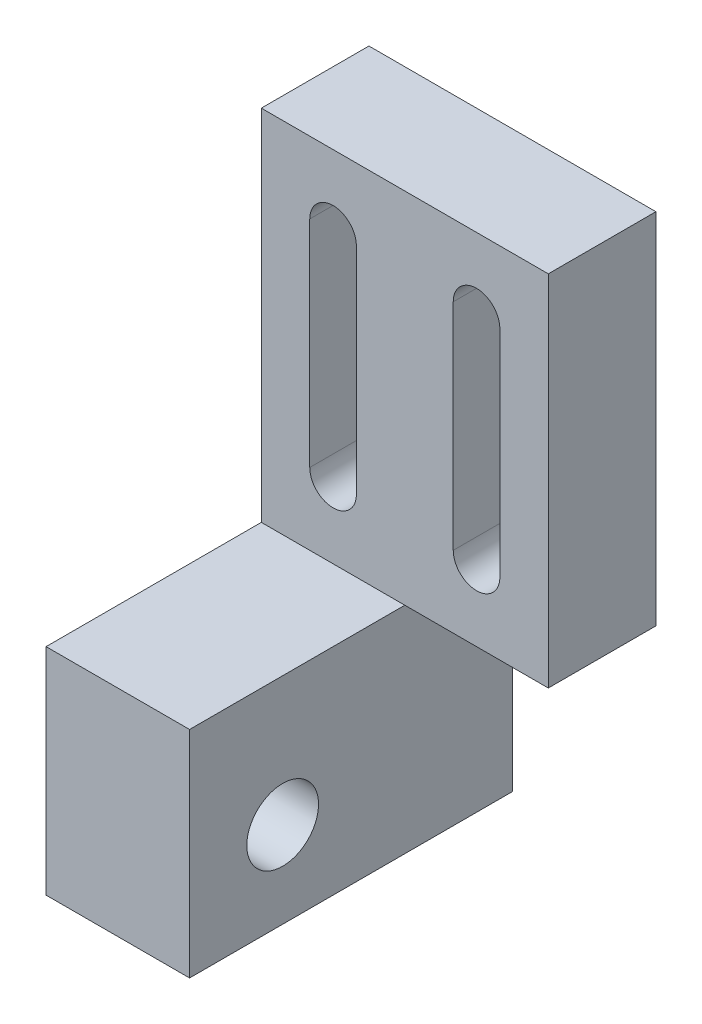
ISO-10303-21;
HEADER;
FILE_DESCRIPTION(('STEP AP214'),'2;1');
FILE_NAME('part.step','',(''),(''),'','','');
FILE_SCHEMA(('AUTOMOTIVE_DESIGN { 1 0 10303 214 1 1 1 1 }'));
ENDSEC;
DATA;
#1=APPLICATION_CONTEXT('core data for automotive mechanical design processes');
#2=APPLICATION_PROTOCOL_DEFINITION('international standard','automotive_design',2000,#1);
#3=PRODUCT_CONTEXT('',#1,'mechanical');
#4=PRODUCT('Part','Part','',(#3));
#5=PRODUCT_RELATED_PRODUCT_CATEGORY('part','',(#4));
#6=PRODUCT_DEFINITION_FORMATION('','',#4);
#7=PRODUCT_DEFINITION_CONTEXT('part definition',#1,'design');
#8=PRODUCT_DEFINITION('design','',#6,#7);
#9=PRODUCT_DEFINITION_SHAPE('','',#8);
#10=(LENGTH_UNIT() NAMED_UNIT(*) SI_UNIT(.MILLI.,.METRE.));
#11=(NAMED_UNIT(*) PLANE_ANGLE_UNIT() SI_UNIT($,.RADIAN.));
#12=(NAMED_UNIT(*) SI_UNIT($,.STERADIAN.) SOLID_ANGLE_UNIT());
#13=UNCERTAINTY_MEASURE_WITH_UNIT(LENGTH_MEASURE(1.E-05),#10,'distance_accuracy_value','');
#14=(GEOMETRIC_REPRESENTATION_CONTEXT(3) GLOBAL_UNCERTAINTY_ASSIGNED_CONTEXT((#13)) GLOBAL_UNIT_ASSIGNED_CONTEXT((#10,
#11,#12)) REPRESENTATION_CONTEXT('',''));
#15=CARTESIAN_POINT('',(0.,0.,0.));
#16=DIRECTION('',(0.,0.,1.));
#17=DIRECTION('',(1.,0.,0.));
#18=AXIS2_PLACEMENT_3D('',#15,#16,#17);
#19=CARTESIAN_POINT('',(-84.6,6.47000000000013,9.));
#20=DIRECTION('',(0.,-1.,0.));
#21=DIRECTION('',(0.,0.,-1.));
#22=AXIS2_PLACEMENT_3D('',#19,#20,#21);
#23=PLANE('',#22);
#24=DIRECTION('',(1.,0.,0.));
#25=VECTOR('',#24,1.);
#26=CARTESIAN_POINT('',(-84.6,6.47000000000013,3.));
#27=LINE('',#26,#25);
#28=CARTESIAN_POINT('',(-84.6,6.47000000000013,3.));
#29=VERTEX_POINT('',#28);
#30=CARTESIAN_POINT('',(-80.6,6.47000000000013,3.));
#31=VERTEX_POINT('',#30);
#32=EDGE_CURVE('E224',#29,#31,#27,.T.);
#33=ORIENTED_EDGE('',*,*,#32,.F.);
#34=DIRECTION('',(0.,0.,-1.));
#35=VECTOR('',#34,1.);
#36=CARTESIAN_POINT('',(-84.6,6.47000000000013,9.));
#37=LINE('',#36,#35);
#38=CARTESIAN_POINT('',(-84.6,6.47000000000013,9.));
#39=VERTEX_POINT('',#38);
#40=EDGE_CURVE('E257',#39,#29,#37,.T.);
#41=ORIENTED_EDGE('',*,*,#40,.F.);
#42=DIRECTION('',(-1.,0.,0.));
#43=VECTOR('',#42,1.);
#44=CARTESIAN_POINT('',(-84.6,6.47000000000013,9.));
#45=LINE('',#44,#43);
#46=CARTESIAN_POINT('',(-80.6,6.47000000000013,9.));
#47=VERTEX_POINT('',#46);
#48=EDGE_CURVE('E255',#47,#39,#45,.T.);
#49=ORIENTED_EDGE('',*,*,#48,.F.);
#50=DIRECTION('',(0.,0.,-1.));
#51=VECTOR('',#50,1.);
#52=CARTESIAN_POINT('',(-80.6,6.47000000000013,9.));
#53=LINE('',#52,#51);
#54=EDGE_CURVE('E266',#47,#31,#53,.T.);
#55=ORIENTED_EDGE('',*,*,#54,.T.);
#56=EDGE_LOOP('',(#33,#41,#49,#55));
#57=FACE_BOUND('',#56,.T.);
#58=ADVANCED_FACE('F35',(#57),#23,.F.);
#59=CARTESIAN_POINT('',(-84.6,6.47000000000013,9.));
#60=DIRECTION('',(1.,0.,0.));
#61=DIRECTION('',(0.,0.,-1.));
#62=AXIS2_PLACEMENT_3D('',#59,#60,#61);
#63=PLANE('',#62);
#64=CARTESIAN_POINT('',(-84.6,2.87000000000013,6.40499999999975));
#65=DIRECTION('',(-1.,0.,0.));
#66=DIRECTION('',(0.,0.,1.));
#67=AXIS2_PLACEMENT_3D('',#64,#65,#66);
#68=CIRCLE('',#67,1.);
#69=CARTESIAN_POINT('',(-84.6,2.87000000000013,7.40499999999975));
#70=VERTEX_POINT('',#69);
#71=EDGE_CURVE('E184',#70,#70,#68,.T.);
#72=ORIENTED_EDGE('',*,*,#71,.F.);
#73=EDGE_LOOP('',(#72));
#74=FACE_BOUND('',#73,.T.);
#75=DIRECTION('',(0.,-1.,0.));
#76=VECTOR('',#75,1.);
#77=CARTESIAN_POINT('',(-84.6,6.47000000000013,0.));
#78=LINE('',#77,#76);
#79=CARTESIAN_POINT('',(-84.6,16.4700000000001,0.));
#80=VERTEX_POINT('',#79);
#81=CARTESIAN_POINT('',(-84.6,0.470000000000128,0.));
#82=VERTEX_POINT('',#81);
#83=EDGE_CURVE('E246',#80,#82,#78,.T.);
#84=ORIENTED_EDGE('',*,*,#83,.T.);
#85=DIRECTION('',(0.,0.,-1.));
#86=VECTOR('',#85,1.);
#87=CARTESIAN_POINT('',(-84.6,0.470000000000128,9.));
#88=LINE('',#87,#86);
#89=CARTESIAN_POINT('',(-84.6,0.470000000000128,9.));
#90=VERTEX_POINT('',#89);
#91=EDGE_CURVE('E11',#90,#82,#88,.T.);
#92=ORIENTED_EDGE('',*,*,#91,.F.);
#93=DIRECTION('',(0.,-1.,0.));
#94=VECTOR('',#93,1.);
#95=CARTESIAN_POINT('',(-84.6,6.47000000000013,9.));
#96=LINE('',#95,#94);
#97=EDGE_CURVE('E247',#39,#90,#96,.T.);
#98=ORIENTED_EDGE('',*,*,#97,.F.);
#99=ORIENTED_EDGE('',*,*,#40,.T.);
#100=DIRECTION('',(0.,-1.,0.));
#101=VECTOR('',#100,1.);
#102=CARTESIAN_POINT('',(-84.6,6.47000000000013,3.));
#103=LINE('',#102,#101);
#104=CARTESIAN_POINT('',(-84.6,16.4700000000001,3.));
#105=VERTEX_POINT('',#104);
#106=EDGE_CURVE('E219',#105,#29,#103,.T.);
#107=ORIENTED_EDGE('',*,*,#106,.F.);
#108=DIRECTION('',(0.,0.,-1.));
#109=VECTOR('',#108,1.);
#110=CARTESIAN_POINT('',(-84.6,16.4700000000001,3.));
#111=LINE('',#110,#109);
#112=EDGE_CURVE('E231',#105,#80,#111,.T.);
#113=ORIENTED_EDGE('',*,*,#112,.T.);
#114=EDGE_LOOP('',(#84,#92,#98,#99,#107,#113));
#115=FACE_BOUND('',#114,.T.);
#116=ADVANCED_FACE('F37',(#74,#115),#63,.F.);
#117=CARTESIAN_POINT('',(-84.6,0.470000000000128,9.));
#118=DIRECTION('',(0.,1.,0.));
#119=DIRECTION('',(0.,0.,1.));
#120=AXIS2_PLACEMENT_3D('',#117,#118,#119);
#121=PLANE('',#120);
#122=DIRECTION('',(1.,0.,0.));
#123=VECTOR('',#122,1.);
#124=CARTESIAN_POINT('',(-84.6,0.470000000000128,0.));
#125=LINE('',#124,#123);
#126=CARTESIAN_POINT('',(-80.6,0.470000000000128,0.));
#127=VERTEX_POINT('',#126);
#128=EDGE_CURVE('E260',#82,#127,#125,.T.);
#129=ORIENTED_EDGE('',*,*,#128,.T.);
#130=DIRECTION('',(0.,0.,-1.));
#131=VECTOR('',#130,1.);
#132=CARTESIAN_POINT('',(-80.6,0.470000000000128,9.));
#133=LINE('',#132,#131);
#134=CARTESIAN_POINT('',(-80.6,0.470000000000128,9.));
#135=VERTEX_POINT('',#134);
#136=EDGE_CURVE('E44',#135,#127,#133,.T.);
#137=ORIENTED_EDGE('',*,*,#136,.F.);
#138=DIRECTION('',(1.,0.,0.));
#139=VECTOR('',#138,1.);
#140=CARTESIAN_POINT('',(-84.6,0.470000000000128,9.));
#141=LINE('',#140,#139);
#142=EDGE_CURVE('E250',#90,#135,#141,.T.);
#143=ORIENTED_EDGE('',*,*,#142,.F.);
#144=ORIENTED_EDGE('',*,*,#91,.T.);
#145=EDGE_LOOP('',(#129,#137,#143,#144));
#146=FACE_BOUND('',#145,.T.);
#147=ADVANCED_FACE('F303',(#146),#121,.F.);
#148=CARTESIAN_POINT('',(-80.6,6.47000000000013,9.));
#149=DIRECTION('',(-1.,0.,0.));
#150=DIRECTION('',(0.,0.,1.));
#151=AXIS2_PLACEMENT_3D('',#148,#149,#150);
#152=PLANE('',#151);
#153=CARTESIAN_POINT('',(-80.6,2.87000000000013,6.40499999999975));
#154=DIRECTION('',(-1.,0.,0.));
#155=DIRECTION('',(0.,0.,1.));
#156=AXIS2_PLACEMENT_3D('',#153,#154,#155);
#157=CIRCLE('',#156,1.);
#158=CARTESIAN_POINT('',(-80.6,2.87000000000013,7.40499999999975));
#159=VERTEX_POINT('',#158);
#160=EDGE_CURVE('E39',#159,#159,#157,.T.);
#161=ORIENTED_EDGE('',*,*,#160,.T.);
#162=EDGE_LOOP('',(#161));
#163=FACE_BOUND('',#162,.T.);
#164=DIRECTION('',(0.,1.,0.));
#165=VECTOR('',#164,1.);
#166=CARTESIAN_POINT('',(-80.6,6.47000000000013,0.));
#167=LINE('',#166,#165);
#168=CARTESIAN_POINT('',(-80.6,6.47000000000013,0.));
#169=VERTEX_POINT('',#168);
#170=EDGE_CURVE('E251',#127,#169,#167,.T.);
#171=ORIENTED_EDGE('',*,*,#170,.T.);
#172=EDGE_CURVE('E265',#31,#169,#53,.T.);
#173=ORIENTED_EDGE('',*,*,#172,.F.);
#174=ORIENTED_EDGE('',*,*,#54,.F.);
#175=DIRECTION('',(0.,1.,0.));
#176=VECTOR('',#175,1.);
#177=CARTESIAN_POINT('',(-80.6,6.47000000000013,9.));
#178=LINE('',#177,#176);
#179=EDGE_CURVE('E253',#135,#47,#178,.T.);
#180=ORIENTED_EDGE('',*,*,#179,.F.);
#181=ORIENTED_EDGE('',*,*,#136,.T.);
#182=EDGE_LOOP('',(#171,#173,#174,#180,#181));
#183=FACE_BOUND('',#182,.T.);
#184=ADVANCED_FACE('F273',(#163,#183),#152,.F.);
#185=CARTESIAN_POINT('',(0.,0.,9.));
#186=DIRECTION('',(0.,0.,1.));
#187=DIRECTION('',(1.,0.,0.));
#188=AXIS2_PLACEMENT_3D('',#185,#186,#187);
#189=PLANE('',#188);
#190=ORIENTED_EDGE('',*,*,#97,.T.);
#191=ORIENTED_EDGE('',*,*,#142,.T.);
#192=ORIENTED_EDGE('',*,*,#179,.T.);
#193=ORIENTED_EDGE('',*,*,#48,.T.);
#194=EDGE_LOOP('',(#190,#191,#192,#193));
#195=FACE_BOUND('',#194,.T.);
#196=ADVANCED_FACE('F302',(#195),#189,.T.);
#197=CARTESIAN_POINT('',(0.,0.,0.));
#198=DIRECTION('',(0.,0.,1.));
#199=DIRECTION('',(1.,0.,0.));
#200=AXIS2_PLACEMENT_3D('',#197,#198,#199);
#201=PLANE('',#200);
#202=DIRECTION('',(0.,-1.,0.));
#203=VECTOR('',#202,1.);
#204=CARTESIAN_POINT('',(-83.25,8.47000000000013,0.));
#205=LINE('',#204,#203);
#206=CARTESIAN_POINT('',(-83.25,14.4700000000001,0.));
#207=VERTEX_POINT('',#206);
#208=CARTESIAN_POINT('',(-83.25,8.47000000000013,0.));
#209=VERTEX_POINT('',#208);
#210=EDGE_CURVE('E158',#207,#209,#205,.T.);
#211=ORIENTED_EDGE('',*,*,#210,.T.);
#212=CARTESIAN_POINT('',(-82.6,8.47000000000013,0.));
#213=DIRECTION('',(0.,0.,1.));
#214=DIRECTION('',(1.,0.,0.));
#215=AXIS2_PLACEMENT_3D('',#212,#213,#214);
#216=CIRCLE('',#215,0.649999999999998);
#217=CARTESIAN_POINT('',(-81.95,8.47000000000013,0.));
#218=VERTEX_POINT('',#217);
#219=EDGE_CURVE('E150',#209,#218,#216,.T.);
#220=ORIENTED_EDGE('',*,*,#219,.T.);
#221=DIRECTION('',(0.,1.,0.));
#222=VECTOR('',#221,1.);
#223=CARTESIAN_POINT('',(-81.95,8.47000000000013,0.));
#224=LINE('',#223,#222);
#225=CARTESIAN_POINT('',(-81.95,14.4700000000001,0.));
#226=VERTEX_POINT('',#225);
#227=EDGE_CURVE('E161',#218,#226,#224,.T.);
#228=ORIENTED_EDGE('',*,*,#227,.T.);
#229=CARTESIAN_POINT('',(-82.6,14.4700000000001,0.));
#230=DIRECTION('',(0.,0.,1.));
#231=DIRECTION('',(1.,0.,0.));
#232=AXIS2_PLACEMENT_3D('',#229,#230,#231);
#233=CIRCLE('',#232,0.649999999999998);
#234=EDGE_CURVE('E51',#226,#207,#233,.T.);
#235=ORIENTED_EDGE('',*,*,#234,.T.);
#236=EDGE_LOOP('',(#211,#220,#228,#235));
#237=FACE_BOUND('',#236,.T.);
#238=DIRECTION('',(0.,1.,0.));
#239=VECTOR('',#238,1.);
#240=CARTESIAN_POINT('',(-77.95,14.4700000000001,0.));
#241=LINE('',#240,#239);
#242=CARTESIAN_POINT('',(-77.95,8.47000000000013,0.));
#243=VERTEX_POINT('',#242);
#244=CARTESIAN_POINT('',(-77.95,14.4700000000001,0.));
#245=VERTEX_POINT('',#244);
#246=EDGE_CURVE('E196',#243,#245,#241,.T.);
#247=ORIENTED_EDGE('',*,*,#246,.T.);
#248=CARTESIAN_POINT('',(-78.6,14.4700000000001,0.));
#249=DIRECTION('',(0.,0.,1.));
#250=DIRECTION('',(1.,0.,0.));
#251=AXIS2_PLACEMENT_3D('',#248,#249,#250);
#252=CIRCLE('',#251,0.649999999999998);
#253=CARTESIAN_POINT('',(-79.25,14.4700000000001,0.));
#254=VERTEX_POINT('',#253);
#255=EDGE_CURVE('E188',#245,#254,#252,.T.);
#256=ORIENTED_EDGE('',*,*,#255,.T.);
#257=DIRECTION('',(0.,-1.,0.));
#258=VECTOR('',#257,1.);
#259=CARTESIAN_POINT('',(-79.25,14.4700000000001,0.));
#260=LINE('',#259,#258);
#261=CARTESIAN_POINT('',(-79.25,8.47000000000013,0.));
#262=VERTEX_POINT('',#261);
#263=EDGE_CURVE('E191',#254,#262,#260,.T.);
#264=ORIENTED_EDGE('',*,*,#263,.T.);
#265=CARTESIAN_POINT('',(-78.6,8.47000000000013,0.));
#266=DIRECTION('',(0.,0.,1.));
#267=DIRECTION('',(1.,0.,0.));
#268=AXIS2_PLACEMENT_3D('',#265,#266,#267);
#269=CIRCLE('',#268,0.649999999999998);
#270=EDGE_CURVE('E59',#262,#243,#269,.T.);
#271=ORIENTED_EDGE('',*,*,#270,.T.);
#272=EDGE_LOOP('',(#247,#256,#264,#271));
#273=FACE_BOUND('',#272,.T.);
#274=ORIENTED_EDGE('',*,*,#83,.F.);
#275=DIRECTION('',(-1.,0.,0.));
#276=VECTOR('',#275,1.);
#277=CARTESIAN_POINT('',(-84.6,16.4700000000001,0.));
#278=LINE('',#277,#276);
#279=CARTESIAN_POINT('',(-76.6,16.4700000000001,0.));
#280=VERTEX_POINT('',#279);
#281=EDGE_CURVE('E223',#280,#80,#278,.T.);
#282=ORIENTED_EDGE('',*,*,#281,.F.);
#283=DIRECTION('',(0.,1.,0.));
#284=VECTOR('',#283,1.);
#285=CARTESIAN_POINT('',(-76.6,6.47000000000013,0.));
#286=LINE('',#285,#284);
#287=CARTESIAN_POINT('',(-76.6,6.47000000000013,0.));
#288=VERTEX_POINT('',#287);
#289=EDGE_CURVE('E234',#288,#280,#286,.T.);
#290=ORIENTED_EDGE('',*,*,#289,.F.);
#291=DIRECTION('',(1.,0.,0.));
#292=VECTOR('',#291,1.);
#293=CARTESIAN_POINT('',(-84.6,6.47000000000013,0.));
#294=LINE('',#293,#292);
#295=EDGE_CURVE('E232',#169,#288,#294,.T.);
#296=ORIENTED_EDGE('',*,*,#295,.F.);
#297=ORIENTED_EDGE('',*,*,#170,.F.);
#298=ORIENTED_EDGE('',*,*,#128,.F.);
#299=EDGE_LOOP('',(#274,#282,#290,#296,#297,#298));
#300=FACE_BOUND('',#299,.T.);
#301=ADVANCED_FACE('F165',(#237,#273,#300),#201,.F.);
#302=CARTESIAN_POINT('',(-84.6,6.47000000000013,3.));
#303=DIRECTION('',(0.,1.,0.));
#304=DIRECTION('',(0.,0.,1.));
#305=AXIS2_PLACEMENT_3D('',#302,#303,#304);
#306=PLANE('',#305);
#307=CARTESIAN_POINT('',(-76.6,6.47000000000013,3.));
#308=VERTEX_POINT('',#307);
#309=EDGE_CURVE('E222',#31,#308,#27,.T.);
#310=ORIENTED_EDGE('',*,*,#309,.F.);
#311=ORIENTED_EDGE('',*,*,#172,.T.);
#312=ORIENTED_EDGE('',*,*,#295,.T.);
#313=DIRECTION('',(0.,0.,-1.));
#314=VECTOR('',#313,1.);
#315=CARTESIAN_POINT('',(-76.6,6.47000000000013,3.));
#316=LINE('',#315,#314);
#317=EDGE_CURVE('E243',#308,#288,#316,.T.);
#318=ORIENTED_EDGE('',*,*,#317,.F.);
#319=EDGE_LOOP('',(#310,#311,#312,#318));
#320=FACE_BOUND('',#319,.T.);
#321=ADVANCED_FACE('F285',(#320),#306,.F.);
#322=CARTESIAN_POINT('',(-76.6,6.47000000000013,3.));
#323=DIRECTION('',(-1.,0.,0.));
#324=DIRECTION('',(0.,0.,1.));
#325=AXIS2_PLACEMENT_3D('',#322,#323,#324);
#326=PLANE('',#325);
#327=ORIENTED_EDGE('',*,*,#289,.T.);
#328=DIRECTION('',(0.,0.,-1.));
#329=VECTOR('',#328,1.);
#330=CARTESIAN_POINT('',(-76.6,16.4700000000001,3.));
#331=LINE('',#330,#329);
#332=CARTESIAN_POINT('',(-76.6,16.4700000000001,3.));
#333=VERTEX_POINT('',#332);
#334=EDGE_CURVE('E240',#333,#280,#331,.T.);
#335=ORIENTED_EDGE('',*,*,#334,.F.);
#336=DIRECTION('',(0.,1.,0.));
#337=VECTOR('',#336,1.);
#338=CARTESIAN_POINT('',(-76.6,6.47000000000013,3.));
#339=LINE('',#338,#337);
#340=EDGE_CURVE('E227',#308,#333,#339,.T.);
#341=ORIENTED_EDGE('',*,*,#340,.F.);
#342=ORIENTED_EDGE('',*,*,#317,.T.);
#343=EDGE_LOOP('',(#327,#335,#341,#342));
#344=FACE_BOUND('',#343,.T.);
#345=ADVANCED_FACE('F288',(#344),#326,.F.);
#346=CARTESIAN_POINT('',(-84.6,16.4700000000001,3.));
#347=DIRECTION('',(0.,-1.,0.));
#348=DIRECTION('',(0.,0.,-1.));
#349=AXIS2_PLACEMENT_3D('',#346,#347,#348);
#350=PLANE('',#349);
#351=ORIENTED_EDGE('',*,*,#281,.T.);
#352=ORIENTED_EDGE('',*,*,#112,.F.);
#353=DIRECTION('',(-1.,0.,0.));
#354=VECTOR('',#353,1.);
#355=CARTESIAN_POINT('',(-84.6,16.4700000000001,3.));
#356=LINE('',#355,#354);
#357=EDGE_CURVE('E229',#333,#105,#356,.T.);
#358=ORIENTED_EDGE('',*,*,#357,.F.);
#359=ORIENTED_EDGE('',*,*,#334,.T.);
#360=EDGE_LOOP('',(#351,#352,#358,#359));
#361=FACE_BOUND('',#360,.T.);
#362=ADVANCED_FACE('F305',(#361),#350,.F.);
#363=CARTESIAN_POINT('',(0.,0.,3.));
#364=DIRECTION('',(0.,0.,-1.));
#365=DIRECTION('',(-1.,0.,0.));
#366=AXIS2_PLACEMENT_3D('',#363,#364,#365);
#367=PLANE('',#366);
#368=DIRECTION('',(0.,1.,0.));
#369=VECTOR('',#368,1.);
#370=CARTESIAN_POINT('',(-81.95,8.47000000000013,3.));
#371=LINE('',#370,#369);
#372=CARTESIAN_POINT('',(-81.95,8.47000000000013,3.));
#373=VERTEX_POINT('',#372);
#374=CARTESIAN_POINT('',(-81.95,14.4700000000001,3.));
#375=VERTEX_POINT('',#374);
#376=EDGE_CURVE('E177',#373,#375,#371,.T.);
#377=ORIENTED_EDGE('',*,*,#376,.F.);
#378=CARTESIAN_POINT('',(-82.6,8.47000000000013,3.));
#379=DIRECTION('',(0.,0.,1.));
#380=DIRECTION('',(1.,0.,0.));
#381=AXIS2_PLACEMENT_3D('',#378,#379,#380);
#382=CIRCLE('',#381,0.649999999999998);
#383=CARTESIAN_POINT('',(-83.25,8.47000000000013,3.));
#384=VERTEX_POINT('',#383);
#385=EDGE_CURVE('E153',#384,#373,#382,.T.);
#386=ORIENTED_EDGE('',*,*,#385,.F.);
#387=DIRECTION('',(0.,-1.,0.));
#388=VECTOR('',#387,1.);
#389=CARTESIAN_POINT('',(-83.25,8.47000000000013,3.));
#390=LINE('',#389,#388);
#391=CARTESIAN_POINT('',(-83.25,14.4700000000001,3.));
#392=VERTEX_POINT('',#391);
#393=EDGE_CURVE('E168',#392,#384,#390,.T.);
#394=ORIENTED_EDGE('',*,*,#393,.F.);
#395=CARTESIAN_POINT('',(-82.6,14.4700000000001,3.));
#396=DIRECTION('',(0.,0.,1.));
#397=DIRECTION('',(1.,0.,0.));
#398=AXIS2_PLACEMENT_3D('',#395,#396,#397);
#399=CIRCLE('',#398,0.649999999999998);
#400=EDGE_CURVE('E171',#375,#392,#399,.T.);
#401=ORIENTED_EDGE('',*,*,#400,.F.);
#402=EDGE_LOOP('',(#377,#386,#394,#401));
#403=FACE_BOUND('',#402,.T.);
#404=DIRECTION('',(0.,-1.,0.));
#405=VECTOR('',#404,1.);
#406=CARTESIAN_POINT('',(-79.25,14.4700000000001,3.));
#407=LINE('',#406,#405);
#408=CARTESIAN_POINT('',(-79.25,14.4700000000001,3.));
#409=VERTEX_POINT('',#408);
#410=CARTESIAN_POINT('',(-79.25,8.47000000000013,3.));
#411=VERTEX_POINT('',#410);
#412=EDGE_CURVE('E202',#409,#411,#407,.T.);
#413=ORIENTED_EDGE('',*,*,#412,.F.);
#414=CARTESIAN_POINT('',(-78.6,14.4700000000001,3.));
#415=DIRECTION('',(0.,0.,1.));
#416=DIRECTION('',(1.,0.,0.));
#417=AXIS2_PLACEMENT_3D('',#414,#415,#416);
#418=CIRCLE('',#417,0.649999999999998);
#419=CARTESIAN_POINT('',(-77.95,14.4700000000001,3.));
#420=VERTEX_POINT('',#419);
#421=EDGE_CURVE('E200',#420,#409,#418,.T.);
#422=ORIENTED_EDGE('',*,*,#421,.F.);
#423=DIRECTION('',(0.,1.,0.));
#424=VECTOR('',#423,1.);
#425=CARTESIAN_POINT('',(-77.95,14.4700000000001,3.));
#426=LINE('',#425,#424);
#427=CARTESIAN_POINT('',(-77.95,8.47000000000013,3.));
#428=VERTEX_POINT('',#427);
#429=EDGE_CURVE('E192',#428,#420,#426,.T.);
#430=ORIENTED_EDGE('',*,*,#429,.F.);
#431=CARTESIAN_POINT('',(-78.6,8.47000000000013,3.));
#432=DIRECTION('',(0.,0.,1.));
#433=DIRECTION('',(1.,0.,0.));
#434=AXIS2_PLACEMENT_3D('',#431,#432,#433);
#435=CIRCLE('',#434,0.649999999999998);
#436=EDGE_CURVE('E205',#411,#428,#435,.T.);
#437=ORIENTED_EDGE('',*,*,#436,.F.);
#438=EDGE_LOOP('',(#413,#422,#430,#437));
#439=FACE_BOUND('',#438,.T.);
#440=ORIENTED_EDGE('',*,*,#106,.T.);
#441=ORIENTED_EDGE('',*,*,#32,.T.);
#442=ORIENTED_EDGE('',*,*,#309,.T.);
#443=ORIENTED_EDGE('',*,*,#340,.T.);
#444=ORIENTED_EDGE('',*,*,#357,.T.);
#445=EDGE_LOOP('',(#440,#441,#442,#443,#444));
#446=FACE_BOUND('',#445,.T.);
#447=ADVANCED_FACE('F292',(#403,#439,#446),#367,.F.);
#448=CARTESIAN_POINT('',(-76.6,2.87000000000013,6.40499999999975));
#449=DIRECTION('',(-1.,0.,0.));
#450=DIRECTION('',(0.,0.,1.));
#451=AXIS2_PLACEMENT_3D('',#448,#449,#450);
#452=CYLINDRICAL_SURFACE('',#451,1.);
#453=ORIENTED_EDGE('',*,*,#71,.T.);
#454=EDGE_LOOP('',(#453));
#455=FACE_BOUND('',#454,.T.);
#456=ORIENTED_EDGE('',*,*,#160,.F.);
#457=EDGE_LOOP('',(#456));
#458=FACE_BOUND('',#457,.T.);
#459=ADVANCED_FACE('F312',(#455,#458),#452,.F.);
#460=CARTESIAN_POINT('',(-78.6,14.4700000000001,0.));
#461=DIRECTION('',(0.,0.,1.));
#462=DIRECTION('',(1.,0.,0.));
#463=AXIS2_PLACEMENT_3D('',#460,#461,#462);
#464=CYLINDRICAL_SURFACE('',#463,0.649999999999998);
#465=ORIENTED_EDGE('',*,*,#421,.T.);
#466=DIRECTION('',(0.,0.,1.));
#467=VECTOR('',#466,1.);
#468=CARTESIAN_POINT('',(-79.25,14.4700000000001,0.));
#469=LINE('',#468,#467);
#470=EDGE_CURVE('E199',#254,#409,#469,.T.);
#471=ORIENTED_EDGE('',*,*,#470,.F.);
#472=ORIENTED_EDGE('',*,*,#255,.F.);
#473=DIRECTION('',(0.,0.,1.));
#474=VECTOR('',#473,1.);
#475=CARTESIAN_POINT('',(-77.95,14.4700000000001,0.));
#476=LINE('',#475,#474);
#477=EDGE_CURVE('E178',#245,#420,#476,.T.);
#478=ORIENTED_EDGE('',*,*,#477,.T.);
#479=EDGE_LOOP('',(#465,#471,#472,#478));
#480=FACE_BOUND('',#479,.T.);
#481=ADVANCED_FACE('F400',(#480),#464,.F.);
#482=CARTESIAN_POINT('',(-77.95,14.4700000000001,0.));
#483=DIRECTION('',(1.,0.,0.));
#484=DIRECTION('',(0.,0.,-1.));
#485=AXIS2_PLACEMENT_3D('',#482,#483,#484);
#486=PLANE('',#485);
#487=ORIENTED_EDGE('',*,*,#429,.T.);
#488=ORIENTED_EDGE('',*,*,#477,.F.);
#489=ORIENTED_EDGE('',*,*,#246,.F.);
#490=DIRECTION('',(0.,0.,1.));
#491=VECTOR('',#490,1.);
#492=CARTESIAN_POINT('',(-77.95,8.47000000000013,0.));
#493=LINE('',#492,#491);
#494=EDGE_CURVE('E211',#243,#428,#493,.T.);
#495=ORIENTED_EDGE('',*,*,#494,.T.);
#496=EDGE_LOOP('',(#487,#488,#489,#495));
#497=FACE_BOUND('',#496,.T.);
#498=ADVANCED_FACE('F411',(#497),#486,.F.);
#499=CARTESIAN_POINT('',(-78.6,8.47000000000013,0.));
#500=DIRECTION('',(0.,0.,1.));
#501=DIRECTION('',(1.,0.,0.));
#502=AXIS2_PLACEMENT_3D('',#499,#500,#501);
#503=CYLINDRICAL_SURFACE('',#502,0.649999999999998);
#504=ORIENTED_EDGE('',*,*,#436,.T.);
#505=ORIENTED_EDGE('',*,*,#494,.F.);
#506=ORIENTED_EDGE('',*,*,#270,.F.);
#507=DIRECTION('',(0.,0.,1.));
#508=VECTOR('',#507,1.);
#509=CARTESIAN_POINT('',(-79.25,8.47000000000013,0.));
#510=LINE('',#509,#508);
#511=EDGE_CURVE('E213',#262,#411,#510,.T.);
#512=ORIENTED_EDGE('',*,*,#511,.T.);
#513=EDGE_LOOP('',(#504,#505,#506,#512));
#514=FACE_BOUND('',#513,.T.);
#515=ADVANCED_FACE('F420',(#514),#503,.F.);
#516=CARTESIAN_POINT('',(-79.25,14.4700000000001,0.));
#517=DIRECTION('',(-1.,0.,0.));
#518=DIRECTION('',(0.,0.,1.));
#519=AXIS2_PLACEMENT_3D('',#516,#517,#518);
#520=PLANE('',#519);
#521=ORIENTED_EDGE('',*,*,#412,.T.);
#522=ORIENTED_EDGE('',*,*,#511,.F.);
#523=ORIENTED_EDGE('',*,*,#263,.F.);
#524=ORIENTED_EDGE('',*,*,#470,.T.);
#525=EDGE_LOOP('',(#521,#522,#523,#524));
#526=FACE_BOUND('',#525,.T.);
#527=ADVANCED_FACE('F429',(#526),#520,.F.);
#528=CARTESIAN_POINT('',(-82.6,8.47000000000013,0.));
#529=DIRECTION('',(0.,0.,1.));
#530=DIRECTION('',(1.,0.,0.));
#531=AXIS2_PLACEMENT_3D('',#528,#529,#530);
#532=CYLINDRICAL_SURFACE('',#531,0.649999999999998);
#533=ORIENTED_EDGE('',*,*,#385,.T.);
#534=DIRECTION('',(0.,0.,1.));
#535=VECTOR('',#534,1.);
#536=CARTESIAN_POINT('',(-81.95,8.47000000000013,0.));
#537=LINE('',#536,#535);
#538=EDGE_CURVE('E146',#218,#373,#537,.T.);
#539=ORIENTED_EDGE('',*,*,#538,.F.);
#540=ORIENTED_EDGE('',*,*,#219,.F.);
#541=DIRECTION('',(0.,0.,1.));
#542=VECTOR('',#541,1.);
#543=CARTESIAN_POINT('',(-83.25,8.47000000000013,0.));
#544=LINE('',#543,#542);
#545=EDGE_CURVE('E182',#209,#384,#544,.T.);
#546=ORIENTED_EDGE('',*,*,#545,.T.);
#547=EDGE_LOOP('',(#533,#539,#540,#546));
#548=FACE_BOUND('',#547,.T.);
#549=ADVANCED_FACE('F148',(#548),#532,.F.);
#550=CARTESIAN_POINT('',(-83.25,8.47000000000013,0.));
#551=DIRECTION('',(-1.,0.,0.));
#552=DIRECTION('',(0.,0.,1.));
#553=AXIS2_PLACEMENT_3D('',#550,#551,#552);
#554=PLANE('',#553);
#555=ORIENTED_EDGE('',*,*,#393,.T.);
#556=ORIENTED_EDGE('',*,*,#545,.F.);
#557=ORIENTED_EDGE('',*,*,#210,.F.);
#558=DIRECTION('',(0.,0.,1.));
#559=VECTOR('',#558,1.);
#560=CARTESIAN_POINT('',(-83.25,14.4700000000001,0.));
#561=LINE('',#560,#559);
#562=EDGE_CURVE('E185',#207,#392,#561,.T.);
#563=ORIENTED_EDGE('',*,*,#562,.T.);
#564=EDGE_LOOP('',(#555,#556,#557,#563));
#565=FACE_BOUND('',#564,.T.);
#566=ADVANCED_FACE('F445',(#565),#554,.F.);
#567=CARTESIAN_POINT('',(-82.6,14.4700000000001,0.));
#568=DIRECTION('',(0.,0.,1.));
#569=DIRECTION('',(1.,0.,0.));
#570=AXIS2_PLACEMENT_3D('',#567,#568,#569);
#571=CYLINDRICAL_SURFACE('',#570,0.649999999999998);
#572=ORIENTED_EDGE('',*,*,#400,.T.);
#573=ORIENTED_EDGE('',*,*,#562,.F.);
#574=ORIENTED_EDGE('',*,*,#234,.F.);
#575=DIRECTION('',(0.,0.,1.));
#576=VECTOR('',#575,1.);
#577=CARTESIAN_POINT('',(-81.95,14.4700000000001,0.));
#578=LINE('',#577,#576);
#579=EDGE_CURVE('E157',#226,#375,#578,.T.);
#580=ORIENTED_EDGE('',*,*,#579,.T.);
#581=EDGE_LOOP('',(#572,#573,#574,#580));
#582=FACE_BOUND('',#581,.T.);
#583=ADVANCED_FACE('F453',(#582),#571,.F.);
#584=CARTESIAN_POINT('',(-81.95,8.47000000000013,0.));
#585=DIRECTION('',(1.,0.,0.));
#586=DIRECTION('',(0.,0.,-1.));
#587=AXIS2_PLACEMENT_3D('',#584,#585,#586);
#588=PLANE('',#587);
#589=ORIENTED_EDGE('',*,*,#376,.T.);
#590=ORIENTED_EDGE('',*,*,#579,.F.);
#591=ORIENTED_EDGE('',*,*,#227,.F.);
#592=ORIENTED_EDGE('',*,*,#538,.T.);
#593=EDGE_LOOP('',(#589,#590,#591,#592));
#594=FACE_BOUND('',#593,.T.);
#595=ADVANCED_FACE('F162',(#594),#588,.F.);
#596=CLOSED_SHELL('',(#58,#116,#147,#184,#196,#301,#321,#345,#362,#447,#459,#481,#498,#515,#527,
#549,#566,#583,#595));
#597=MANIFOLD_SOLID_BREP('B2',#596);
#598=ADVANCED_BREP_SHAPE_REPRESENTATION('',(#18,#597),#14);
#599=SHAPE_DEFINITION_REPRESENTATION(#9,#598);
ENDSEC;
END-ISO-10303-21;
